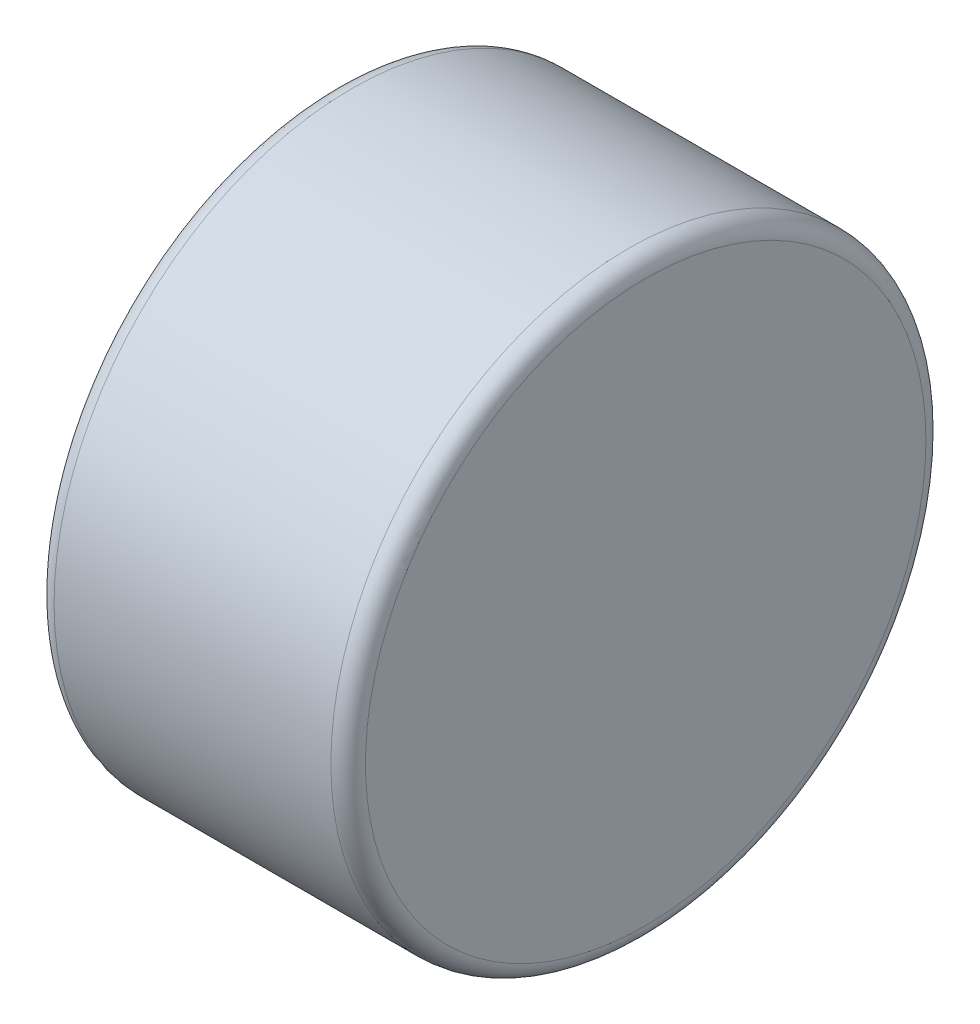
ISO-10303-21;
HEADER;
FILE_DESCRIPTION(('STEP AP214'),'2;1');
FILE_NAME('part.step','',(''),(''),'','','');
FILE_SCHEMA(('AUTOMOTIVE_DESIGN { 1 0 10303 214 1 1 1 1 }'));
ENDSEC;
DATA;
#1=APPLICATION_CONTEXT('core data for automotive mechanical design processes');
#2=APPLICATION_PROTOCOL_DEFINITION('international standard','automotive_design',2000,#1);
#3=PRODUCT_CONTEXT('',#1,'mechanical');
#4=PRODUCT('Part','Part','',(#3));
#5=PRODUCT_RELATED_PRODUCT_CATEGORY('part','',(#4));
#6=PRODUCT_DEFINITION_FORMATION('','',#4);
#7=PRODUCT_DEFINITION_CONTEXT('part definition',#1,'design');
#8=PRODUCT_DEFINITION('design','',#6,#7);
#9=PRODUCT_DEFINITION_SHAPE('','',#8);
#10=(LENGTH_UNIT() NAMED_UNIT(*) SI_UNIT(.MILLI.,.METRE.));
#11=(NAMED_UNIT(*) PLANE_ANGLE_UNIT() SI_UNIT($,.RADIAN.));
#12=(NAMED_UNIT(*) SI_UNIT($,.STERADIAN.) SOLID_ANGLE_UNIT());
#13=UNCERTAINTY_MEASURE_WITH_UNIT(LENGTH_MEASURE(1.E-05),#10,'distance_accuracy_value','');
#14=(GEOMETRIC_REPRESENTATION_CONTEXT(3) GLOBAL_UNCERTAINTY_ASSIGNED_CONTEXT((#13)) GLOBAL_UNIT_ASSIGNED_CONTEXT((#10,
#11,#12)) REPRESENTATION_CONTEXT('',''));
#15=CARTESIAN_POINT('',(0.,0.,0.));
#16=DIRECTION('',(0.,0.,1.));
#17=DIRECTION('',(1.,0.,0.));
#18=AXIS2_PLACEMENT_3D('',#15,#16,#17);
#19=CARTESIAN_POINT('',(36.,0.,0.));
#20=DIRECTION('',(-1.,0.,0.));
#21=DIRECTION('',(0.,0.,1.));
#22=AXIS2_PLACEMENT_3D('',#19,#20,#21);
#23=CYLINDRICAL_SURFACE('',#22,34.4);
#24=CARTESIAN_POINT('',(34.,0.,0.));
#25=DIRECTION('',(1.,0.,0.));
#26=DIRECTION('',(0.,0.,-1.));
#27=AXIS2_PLACEMENT_3D('',#24,#25,#26);
#28=CIRCLE('',#27,34.4);
#29=CARTESIAN_POINT('',(34.,0.,-34.4));
#30=VERTEX_POINT('',#29);
#31=EDGE_CURVE('E55',#30,#30,#28,.F.);
#32=ORIENTED_EDGE('',*,*,#31,.T.);
#33=EDGE_LOOP('',(#32));
#34=FACE_BOUND('',#33,.T.);
#35=CARTESIAN_POINT('',(2.,0.,0.));
#36=DIRECTION('',(1.,0.,0.));
#37=DIRECTION('',(0.,0.,-1.));
#38=AXIS2_PLACEMENT_3D('',#35,#36,#37);
#39=CIRCLE('',#38,34.4);
#40=CARTESIAN_POINT('',(2.,0.,-34.4));
#41=VERTEX_POINT('',#40);
#42=EDGE_CURVE('E60',#41,#41,#39,.T.);
#43=ORIENTED_EDGE('',*,*,#42,.T.);
#44=EDGE_LOOP('',(#43));
#45=FACE_BOUND('',#44,.T.);
#46=ADVANCED_FACE('F47',(#34,#45),#23,.T.);
#47=CARTESIAN_POINT('',(36.,0.,0.));
#48=DIRECTION('',(1.,0.,0.));
#49=DIRECTION('',(0.,0.,-1.));
#50=AXIS2_PLACEMENT_3D('',#47,#48,#49);
#51=PLANE('',#50);
#52=CARTESIAN_POINT('',(36.,0.,0.));
#53=DIRECTION('',(1.,0.,0.));
#54=DIRECTION('',(0.,0.,-1.));
#55=AXIS2_PLACEMENT_3D('',#52,#53,#54);
#56=CIRCLE('',#55,32.4);
#57=CARTESIAN_POINT('',(36.,0.,-32.4));
#58=VERTEX_POINT('',#57);
#59=EDGE_CURVE('E65',#58,#58,#56,.T.);
#60=ORIENTED_EDGE('',*,*,#59,.T.);
#61=EDGE_LOOP('',(#60));
#62=FACE_BOUND('',#61,.T.);
#63=ADVANCED_FACE('F72',(#62),#51,.T.);
#64=CARTESIAN_POINT('',(0.,0.,0.));
#65=DIRECTION('',(1.,0.,0.));
#66=DIRECTION('',(0.,0.,-1.));
#67=AXIS2_PLACEMENT_3D('',#64,#65,#66);
#68=PLANE('',#67);
#69=CARTESIAN_POINT('',(0.,0.,0.));
#70=DIRECTION('',(1.,0.,0.));
#71=DIRECTION('',(0.,0.,-1.));
#72=AXIS2_PLACEMENT_3D('',#69,#70,#71);
#73=CIRCLE('',#72,32.4);
#74=CARTESIAN_POINT('',(0.,0.,-32.4));
#75=VERTEX_POINT('',#74);
#76=EDGE_CURVE('E10',#75,#75,#73,.F.);
#77=ORIENTED_EDGE('',*,*,#76,.T.);
#78=EDGE_LOOP('',(#77));
#79=FACE_BOUND('',#78,.T.);
#80=ADVANCED_FACE('F76',(#79),#68,.F.);
#81=CARTESIAN_POINT('',(34.,0.,0.));
#82=DIRECTION('',(1.,0.,0.));
#83=DIRECTION('',(0.,0.,-1.));
#84=AXIS2_PLACEMENT_3D('',#81,#82,#83);
#85=TOROIDAL_SURFACE('',#84,32.4,2.);
#86=ORIENTED_EDGE('',*,*,#31,.F.);
#87=EDGE_LOOP('',(#86));
#88=FACE_BOUND('',#87,.T.);
#89=ORIENTED_EDGE('',*,*,#59,.F.);
#90=EDGE_LOOP('',(#89));
#91=FACE_BOUND('',#90,.T.);
#92=ADVANCED_FACE('F74',(#88,#91),#85,.T.);
#93=CARTESIAN_POINT('',(2.,0.,0.));
#94=DIRECTION('',(1.,0.,0.));
#95=DIRECTION('',(0.,0.,-1.));
#96=AXIS2_PLACEMENT_3D('',#93,#94,#95);
#97=TOROIDAL_SURFACE('',#96,32.4,2.);
#98=ORIENTED_EDGE('',*,*,#76,.F.);
#99=EDGE_LOOP('',(#98));
#100=FACE_BOUND('',#99,.T.);
#101=ORIENTED_EDGE('',*,*,#42,.F.);
#102=EDGE_LOOP('',(#101));
#103=FACE_BOUND('',#102,.T.);
#104=ADVANCED_FACE('F49',(#100,#103),#97,.T.);
#105=CLOSED_SHELL('',(#46,#63,#80,#92,#104));
#106=MANIFOLD_SOLID_BREP('B2',#105);
#107=ADVANCED_BREP_SHAPE_REPRESENTATION('',(#18,#106),#14);
#108=SHAPE_DEFINITION_REPRESENTATION(#9,#107);
ENDSEC;
END-ISO-10303-21;
